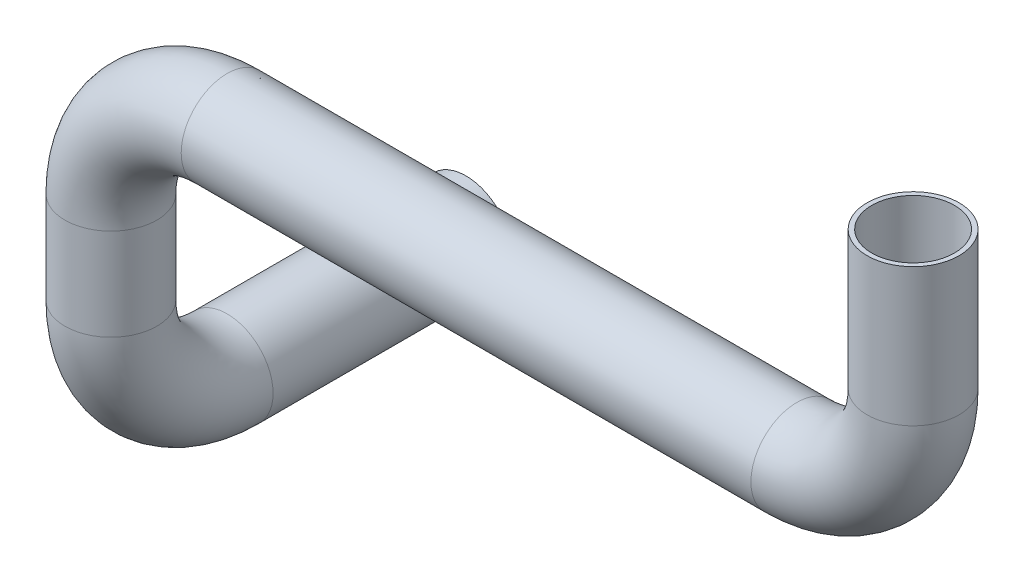
ISO-10303-21;
HEADER;
FILE_DESCRIPTION(('STEP AP214'),'2;1');
FILE_NAME('part.step','',(''),(''),'','','');
FILE_SCHEMA(('AUTOMOTIVE_DESIGN { 1 0 10303 214 1 1 1 1 }'));
ENDSEC;
DATA;
#1=APPLICATION_CONTEXT('core data for automotive mechanical design processes');
#2=APPLICATION_PROTOCOL_DEFINITION('international standard','automotive_design',2000,#1);
#3=PRODUCT_CONTEXT('',#1,'mechanical');
#4=PRODUCT('Part','Part','',(#3));
#5=PRODUCT_RELATED_PRODUCT_CATEGORY('part','',(#4));
#6=PRODUCT_DEFINITION_FORMATION('','',#4);
#7=PRODUCT_DEFINITION_CONTEXT('part definition',#1,'design');
#8=PRODUCT_DEFINITION('design','',#6,#7);
#9=PRODUCT_DEFINITION_SHAPE('','',#8);
#10=(LENGTH_UNIT() NAMED_UNIT(*) SI_UNIT(.MILLI.,.METRE.));
#11=(NAMED_UNIT(*) PLANE_ANGLE_UNIT() SI_UNIT($,.RADIAN.));
#12=(NAMED_UNIT(*) SI_UNIT($,.STERADIAN.) SOLID_ANGLE_UNIT());
#13=UNCERTAINTY_MEASURE_WITH_UNIT(LENGTH_MEASURE(1.E-05),#10,'distance_accuracy_value','');
#14=(GEOMETRIC_REPRESENTATION_CONTEXT(3) GLOBAL_UNCERTAINTY_ASSIGNED_CONTEXT((#13)) GLOBAL_UNIT_ASSIGNED_CONTEXT((#10,
#11,#12)) REPRESENTATION_CONTEXT('',''));
#15=CARTESIAN_POINT('',(0.,0.,0.));
#16=DIRECTION('',(0.,0.,1.));
#17=DIRECTION('',(1.,0.,0.));
#18=AXIS2_PLACEMENT_3D('',#15,#16,#17);
#19=CARTESIAN_POINT('',(0.,0.,0.));
#20=DIRECTION('',(0.,1.,0.));
#21=DIRECTION('',(1.,0.,0.));
#22=AXIS2_PLACEMENT_3D('',#19,#20,#21);
#23=PLANE('',#22);
#24=CARTESIAN_POINT('',(0.,0.,0.));
#25=DIRECTION('',(0.,1.,0.));
#26=DIRECTION('',(0.,0.,1.));
#27=AXIS2_PLACEMENT_3D('',#24,#25,#26);
#28=CIRCLE('',#27,4.5);
#29=CARTESIAN_POINT('',(0.,0.,4.5));
#30=VERTEX_POINT('',#29);
#31=EDGE_CURVE('E93',#30,#30,#28,.T.);
#32=ORIENTED_EDGE('',*,*,#31,.F.);
#33=EDGE_LOOP('',(#32));
#34=FACE_BOUND('',#33,.T.);
#35=CARTESIAN_POINT('',(0.,0.,0.));
#36=DIRECTION('',(0.,1.,0.));
#37=DIRECTION('',(1.,0.,0.));
#38=AXIS2_PLACEMENT_3D('',#35,#36,#37);
#39=CIRCLE('',#38,5.);
#40=CARTESIAN_POINT('',(5.,0.,0.));
#41=VERTEX_POINT('',#40);
#42=EDGE_CURVE('E84',#41,#41,#39,.T.);
#43=ORIENTED_EDGE('',*,*,#42,.T.);
#44=EDGE_LOOP('',(#43));
#45=FACE_BOUND('',#44,.T.);
#46=ADVANCED_FACE('F49',(#34,#45),#23,.T.);
#47=CARTESIAN_POINT('',(-87.3,-62.95,-38.65));
#48=DIRECTION('',(0.,0.,1.));
#49=DIRECTION('',(1.,0.,0.));
#50=AXIS2_PLACEMENT_3D('',#47,#48,#49);
#51=PLANE('',#50);
#52=CARTESIAN_POINT('',(-87.3,-62.95,-38.65));
#53=DIRECTION('',(0.,0.,1.));
#54=DIRECTION('',(1.,0.,0.));
#55=AXIS2_PLACEMENT_3D('',#52,#53,#54);
#56=CIRCLE('',#55,4.5);
#57=CARTESIAN_POINT('',(-82.8,-62.95,-38.65));
#58=VERTEX_POINT('',#57);
#59=EDGE_CURVE('E88',#58,#58,#56,.T.);
#60=ORIENTED_EDGE('',*,*,#59,.T.);
#61=EDGE_LOOP('',(#60));
#62=FACE_BOUND('',#61,.T.);
#63=CARTESIAN_POINT('',(-87.3,-62.95,-38.65));
#64=DIRECTION('',(0.,0.,1.));
#65=DIRECTION('',(1.,0.,0.));
#66=AXIS2_PLACEMENT_3D('',#63,#64,#65);
#67=CIRCLE('',#66,5.);
#68=CARTESIAN_POINT('',(-82.3,-62.95,-38.65));
#69=VERTEX_POINT('',#68);
#70=EDGE_CURVE('E11',#69,#69,#67,.T.);
#71=ORIENTED_EDGE('',*,*,#70,.F.);
#72=EDGE_LOOP('',(#71));
#73=FACE_BOUND('',#72,.T.);
#74=ADVANCED_FACE('F132',(#62,#73),#51,.F.);
#75=CARTESIAN_POINT('',(0.,0.,0.));
#76=DIRECTION('',(0.,-1.,0.));
#77=DIRECTION('',(0.,0.,-1.));
#78=AXIS2_PLACEMENT_3D('',#75,#76,#77);
#79=CYLINDRICAL_SURFACE('',#78,5.);
#80=CARTESIAN_POINT('',(0.,-15.,0.));
#81=DIRECTION('',(0.,1.,0.));
#82=DIRECTION('',(1.,0.,0.));
#83=AXIS2_PLACEMENT_3D('',#80,#81,#82);
#84=CIRCLE('',#83,5.);
#85=CARTESIAN_POINT('',(5.00000000000001,-15.,0.));
#86=VERTEX_POINT('',#85);
#87=EDGE_CURVE('E80',#86,#86,#84,.T.);
#88=ORIENTED_EDGE('',*,*,#87,.T.);
#89=EDGE_LOOP('',(#88));
#90=FACE_BOUND('',#89,.T.);
#91=ORIENTED_EDGE('',*,*,#42,.F.);
#92=EDGE_LOOP('',(#91));
#93=FACE_BOUND('',#92,.T.);
#94=ADVANCED_FACE('F136',(#90,#93),#79,.T.);
#95=CARTESIAN_POINT('',(-12.65,-15.,0.));
#96=DIRECTION('',(0.,0.,-1.));
#97=DIRECTION('',(-1.,0.,0.));
#98=AXIS2_PLACEMENT_3D('',#95,#96,#97);
#99=TOROIDAL_SURFACE('',#98,12.65,5.);
#100=CARTESIAN_POINT('',(-12.65,-27.65,0.));
#101=DIRECTION('',(1.,0.,0.));
#102=DIRECTION('',(0.,-1.,0.));
#103=AXIS2_PLACEMENT_3D('',#100,#101,#102);
#104=CIRCLE('',#103,5.);
#105=CARTESIAN_POINT('',(-12.65,-32.65,0.));
#106=VERTEX_POINT('',#105);
#107=EDGE_CURVE('E76',#106,#106,#104,.T.);
#108=CARTESIAN_POINT('',(-12.65,-15.,0.));
#109=DIRECTION('',(0.,0.,-1.));
#110=DIRECTION('',(-1.,0.,0.));
#111=AXIS2_PLACEMENT_3D('',#108,#109,#110);
#112=CIRCLE('',#111,17.65);
#113=EDGE_CURVE('',#86,#106,#112,.T.);
#114=ORIENTED_EDGE('',*,*,#87,.F.);
#115=ORIENTED_EDGE('',*,*,#107,.T.);
#116=ORIENTED_EDGE('',*,*,#113,.T.);
#117=ORIENTED_EDGE('',*,*,#113,.F.);
#118=EDGE_LOOP('',(#114,#116,#115,#117));
#119=FACE_BOUND('',#118,.T.);
#120=ADVANCED_FACE('F138',(#119),#99,.T.);
#121=CARTESIAN_POINT('',(-12.65,-27.65,0.));
#122=DIRECTION('',(-1.,0.,0.));
#123=DIRECTION('',(0.,-1.,0.));
#124=AXIS2_PLACEMENT_3D('',#121,#122,#123);
#125=CYLINDRICAL_SURFACE('',#124,5.);
#126=CARTESIAN_POINT('',(-74.65,-27.65,0.));
#127=DIRECTION('',(1.,0.,0.));
#128=DIRECTION('',(0.,-1.,0.));
#129=AXIS2_PLACEMENT_3D('',#126,#127,#128);
#130=CIRCLE('',#129,5.);
#131=CARTESIAN_POINT('',(-74.65,-22.65,0.));
#132=VERTEX_POINT('',#131);
#133=EDGE_CURVE('E72',#132,#132,#130,.T.);
#134=ORIENTED_EDGE('',*,*,#133,.T.);
#135=EDGE_LOOP('',(#134));
#136=FACE_BOUND('',#135,.T.);
#137=ORIENTED_EDGE('',*,*,#107,.F.);
#138=EDGE_LOOP('',(#137));
#139=FACE_BOUND('',#138,.T.);
#140=ADVANCED_FACE('F145',(#136,#139),#125,.T.);
#141=CARTESIAN_POINT('',(-74.65,-40.3,0.));
#142=DIRECTION('',(0.,0.,1.));
#143=DIRECTION('',(1.,0.,0.));
#144=AXIS2_PLACEMENT_3D('',#141,#142,#143);
#145=TOROIDAL_SURFACE('',#144,12.65,5.);
#146=CARTESIAN_POINT('',(-87.3,-40.3,0.));
#147=DIRECTION('',(0.,1.,0.));
#148=DIRECTION('',(1.,0.,0.));
#149=AXIS2_PLACEMENT_3D('',#146,#147,#148);
#150=CIRCLE('',#149,5.);
#151=CARTESIAN_POINT('',(-92.3,-40.3,0.));
#152=VERTEX_POINT('',#151);
#153=EDGE_CURVE('E66',#152,#152,#150,.T.);
#154=CARTESIAN_POINT('',(-74.65,-40.3,0.));
#155=DIRECTION('',(0.,0.,1.));
#156=DIRECTION('',(1.,0.,0.));
#157=AXIS2_PLACEMENT_3D('',#154,#155,#156);
#158=CIRCLE('',#157,17.65);
#159=EDGE_CURVE('',#132,#152,#158,.T.);
#160=ORIENTED_EDGE('',*,*,#133,.F.);
#161=ORIENTED_EDGE('',*,*,#153,.T.);
#162=ORIENTED_EDGE('',*,*,#159,.T.);
#163=ORIENTED_EDGE('',*,*,#159,.F.);
#164=EDGE_LOOP('',(#160,#162,#161,#163));
#165=FACE_BOUND('',#164,.T.);
#166=ADVANCED_FACE('F162',(#165),#145,.T.);
#167=CARTESIAN_POINT('',(-87.3,-40.3,0.));
#168=DIRECTION('',(0.,-1.,0.));
#169=DIRECTION('',(0.,0.,-1.));
#170=AXIS2_PLACEMENT_3D('',#167,#168,#169);
#171=CYLINDRICAL_SURFACE('',#170,5.);
#172=CARTESIAN_POINT('',(-87.3,-50.3,0.));
#173=DIRECTION('',(0.,1.,0.));
#174=DIRECTION('',(1.,0.,0.));
#175=AXIS2_PLACEMENT_3D('',#172,#173,#174);
#176=CIRCLE('',#175,5.);
#177=CARTESIAN_POINT('',(-87.3,-50.3,4.99999999999999));
#178=VERTEX_POINT('',#177);
#179=EDGE_CURVE('E61',#178,#178,#176,.T.);
#180=ORIENTED_EDGE('',*,*,#179,.T.);
#181=EDGE_LOOP('',(#180));
#182=FACE_BOUND('',#181,.T.);
#183=ORIENTED_EDGE('',*,*,#153,.F.);
#184=EDGE_LOOP('',(#183));
#185=FACE_BOUND('',#184,.T.);
#186=ADVANCED_FACE('F156',(#182,#185),#171,.T.);
#187=CARTESIAN_POINT('',(-87.3,-50.3,-12.65));
#188=DIRECTION('',(1.,0.,0.));
#189=DIRECTION('',(0.,0.,-1.));
#190=AXIS2_PLACEMENT_3D('',#187,#188,#189);
#191=TOROIDAL_SURFACE('',#190,12.65,5.);
#192=CARTESIAN_POINT('',(-87.3,-62.95,-12.65));
#193=DIRECTION('',(0.,0.,1.));
#194=DIRECTION('',(1.,0.,0.));
#195=AXIS2_PLACEMENT_3D('',#192,#193,#194);
#196=CIRCLE('',#195,5.);
#197=CARTESIAN_POINT('',(-87.3,-67.95,-12.65));
#198=VERTEX_POINT('',#197);
#199=EDGE_CURVE('E56',#198,#198,#196,.T.);
#200=CARTESIAN_POINT('',(-87.3,-50.3,-12.65));
#201=DIRECTION('',(1.,0.,0.));
#202=DIRECTION('',(0.,0.,-1.));
#203=AXIS2_PLACEMENT_3D('',#200,#201,#202);
#204=CIRCLE('',#203,17.65);
#205=EDGE_CURVE('',#178,#198,#204,.T.);
#206=ORIENTED_EDGE('',*,*,#179,.F.);
#207=ORIENTED_EDGE('',*,*,#199,.T.);
#208=ORIENTED_EDGE('',*,*,#205,.T.);
#209=ORIENTED_EDGE('',*,*,#205,.F.);
#210=EDGE_LOOP('',(#206,#208,#207,#209));
#211=FACE_BOUND('',#210,.T.);
#212=ADVANCED_FACE('F151',(#211),#191,.T.);
#213=CARTESIAN_POINT('',(-87.3,-62.95,-12.65));
#214=DIRECTION('',(0.,0.,-1.));
#215=DIRECTION('',(0.,1.,0.));
#216=AXIS2_PLACEMENT_3D('',#213,#214,#215);
#217=CYLINDRICAL_SURFACE('',#216,5.);
#218=ORIENTED_EDGE('',*,*,#70,.T.);
#219=EDGE_LOOP('',(#218));
#220=FACE_BOUND('',#219,.T.);
#221=ORIENTED_EDGE('',*,*,#199,.F.);
#222=EDGE_LOOP('',(#221));
#223=FACE_BOUND('',#222,.T.);
#224=ADVANCED_FACE('F126',(#220,#223),#217,.T.);
#225=CARTESIAN_POINT('',(0.,0.,0.));
#226=DIRECTION('',(0.,-1.,0.));
#227=DIRECTION('',(0.,0.,-1.));
#228=AXIS2_PLACEMENT_3D('',#225,#226,#227);
#229=CYLINDRICAL_SURFACE('',#228,4.5);
#230=CARTESIAN_POINT('',(0.,-15.,0.));
#231=DIRECTION('',(0.,-1.,0.));
#232=DIRECTION('',(0.,0.,-1.));
#233=AXIS2_PLACEMENT_3D('',#230,#231,#232);
#234=CIRCLE('',#233,4.5);
#235=CARTESIAN_POINT('',(4.50000000000001,-15.,0.));
#236=VERTEX_POINT('',#235);
#237=EDGE_CURVE('E97',#236,#236,#234,.F.);
#238=ORIENTED_EDGE('',*,*,#237,.F.);
#239=EDGE_LOOP('',(#238));
#240=FACE_BOUND('',#239,.T.);
#241=ORIENTED_EDGE('',*,*,#31,.T.);
#242=EDGE_LOOP('',(#241));
#243=FACE_BOUND('',#242,.T.);
#244=ADVANCED_FACE('F123',(#240,#243),#229,.F.);
#245=CARTESIAN_POINT('',(-12.65,-15.,0.));
#246=DIRECTION('',(0.,0.,-1.));
#247=DIRECTION('',(-1.,0.,0.));
#248=AXIS2_PLACEMENT_3D('',#245,#246,#247);
#249=TOROIDAL_SURFACE('',#248,12.65,4.5);
#250=CARTESIAN_POINT('',(-12.65,-27.65,0.));
#251=DIRECTION('',(1.,0.,0.));
#252=DIRECTION('',(0.,1.,0.));
#253=AXIS2_PLACEMENT_3D('',#250,#251,#252);
#254=CIRCLE('',#253,4.5);
#255=CARTESIAN_POINT('',(-12.65,-32.15,0.));
#256=VERTEX_POINT('',#255);
#257=EDGE_CURVE('E113',#256,#256,#254,.T.);
#258=CARTESIAN_POINT('',(-12.65,-15.,0.));
#259=DIRECTION('',(0.,0.,-1.));
#260=DIRECTION('',(-1.,0.,0.));
#261=AXIS2_PLACEMENT_3D('',#258,#259,#260);
#262=CIRCLE('',#261,17.15);
#263=EDGE_CURVE('',#236,#256,#262,.T.);
#264=ORIENTED_EDGE('',*,*,#237,.T.);
#265=ORIENTED_EDGE('',*,*,#257,.F.);
#266=ORIENTED_EDGE('',*,*,#263,.T.);
#267=ORIENTED_EDGE('',*,*,#263,.F.);
#268=EDGE_LOOP('',(#264,#266,#265,#267));
#269=FACE_BOUND('',#268,.T.);
#270=ADVANCED_FACE('F121',(#269),#249,.F.);
#271=CARTESIAN_POINT('',(-12.65,-27.65,0.));
#272=DIRECTION('',(-1.,0.,0.));
#273=DIRECTION('',(0.,-1.,0.));
#274=AXIS2_PLACEMENT_3D('',#271,#272,#273);
#275=CYLINDRICAL_SURFACE('',#274,4.5);
#276=CARTESIAN_POINT('',(-74.65,-27.65,0.));
#277=DIRECTION('',(-1.,0.,0.));
#278=DIRECTION('',(0.,-1.,0.));
#279=AXIS2_PLACEMENT_3D('',#276,#277,#278);
#280=CIRCLE('',#279,4.5);
#281=CARTESIAN_POINT('',(-74.65,-23.15,0.));
#282=VERTEX_POINT('',#281);
#283=EDGE_CURVE('E109',#282,#282,#280,.F.);
#284=ORIENTED_EDGE('',*,*,#283,.F.);
#285=EDGE_LOOP('',(#284));
#286=FACE_BOUND('',#285,.T.);
#287=ORIENTED_EDGE('',*,*,#257,.T.);
#288=EDGE_LOOP('',(#287));
#289=FACE_BOUND('',#288,.T.);
#290=ADVANCED_FACE('F210',(#286,#289),#275,.F.);
#291=CARTESIAN_POINT('',(-74.65,-40.3,0.));
#292=DIRECTION('',(0.,0.,1.));
#293=DIRECTION('',(1.,0.,0.));
#294=AXIS2_PLACEMENT_3D('',#291,#292,#293);
#295=TOROIDAL_SURFACE('',#294,12.65,4.5);
#296=CARTESIAN_POINT('',(-87.3,-40.3,0.));
#297=DIRECTION('',(0.,1.,0.));
#298=DIRECTION('',(-1.,0.,0.));
#299=AXIS2_PLACEMENT_3D('',#296,#297,#298);
#300=CIRCLE('',#299,4.5);
#301=CARTESIAN_POINT('',(-91.8,-40.3,0.));
#302=VERTEX_POINT('',#301);
#303=EDGE_CURVE('E105',#302,#302,#300,.T.);
#304=CARTESIAN_POINT('',(-74.65,-40.3,0.));
#305=DIRECTION('',(0.,0.,1.));
#306=DIRECTION('',(1.,0.,0.));
#307=AXIS2_PLACEMENT_3D('',#304,#305,#306);
#308=CIRCLE('',#307,17.15);
#309=EDGE_CURVE('',#282,#302,#308,.T.);
#310=ORIENTED_EDGE('',*,*,#283,.T.);
#311=ORIENTED_EDGE('',*,*,#303,.F.);
#312=ORIENTED_EDGE('',*,*,#309,.T.);
#313=ORIENTED_EDGE('',*,*,#309,.F.);
#314=EDGE_LOOP('',(#310,#312,#311,#313));
#315=FACE_BOUND('',#314,.T.);
#316=ADVANCED_FACE('F220',(#315),#295,.F.);
#317=CARTESIAN_POINT('',(-87.3,-40.3,0.));
#318=DIRECTION('',(0.,-1.,0.));
#319=DIRECTION('',(0.,0.,-1.));
#320=AXIS2_PLACEMENT_3D('',#317,#318,#319);
#321=CYLINDRICAL_SURFACE('',#320,4.5);
#322=CARTESIAN_POINT('',(-87.3,-50.3,0.));
#323=DIRECTION('',(0.,-1.,0.));
#324=DIRECTION('',(0.,0.,-1.));
#325=AXIS2_PLACEMENT_3D('',#322,#323,#324);
#326=CIRCLE('',#325,4.5);
#327=CARTESIAN_POINT('',(-87.3,-50.3,4.49999999999999));
#328=VERTEX_POINT('',#327);
#329=EDGE_CURVE('E101',#328,#328,#326,.F.);
#330=ORIENTED_EDGE('',*,*,#329,.F.);
#331=EDGE_LOOP('',(#330));
#332=FACE_BOUND('',#331,.T.);
#333=ORIENTED_EDGE('',*,*,#303,.T.);
#334=EDGE_LOOP('',(#333));
#335=FACE_BOUND('',#334,.T.);
#336=ADVANCED_FACE('F230',(#332,#335),#321,.F.);
#337=CARTESIAN_POINT('',(-87.3,-50.3,-12.65));
#338=DIRECTION('',(1.,0.,0.));
#339=DIRECTION('',(0.,0.,-1.));
#340=AXIS2_PLACEMENT_3D('',#337,#338,#339);
#341=TOROIDAL_SURFACE('',#340,12.65,4.5);
#342=CARTESIAN_POINT('',(-87.3,-62.95,-12.65));
#343=DIRECTION('',(0.,0.,1.));
#344=DIRECTION('',(0.,-1.,0.));
#345=AXIS2_PLACEMENT_3D('',#342,#343,#344);
#346=CIRCLE('',#345,4.5);
#347=CARTESIAN_POINT('',(-87.3,-67.45,-12.65));
#348=VERTEX_POINT('',#347);
#349=EDGE_CURVE('E92',#348,#348,#346,.T.);
#350=CARTESIAN_POINT('',(-87.3,-50.3,-12.65));
#351=DIRECTION('',(1.,0.,0.));
#352=DIRECTION('',(0.,0.,-1.));
#353=AXIS2_PLACEMENT_3D('',#350,#351,#352);
#354=CIRCLE('',#353,17.15);
#355=EDGE_CURVE('',#328,#348,#354,.T.);
#356=ORIENTED_EDGE('',*,*,#329,.T.);
#357=ORIENTED_EDGE('',*,*,#349,.F.);
#358=ORIENTED_EDGE('',*,*,#355,.T.);
#359=ORIENTED_EDGE('',*,*,#355,.F.);
#360=EDGE_LOOP('',(#356,#358,#357,#359));
#361=FACE_BOUND('',#360,.T.);
#362=ADVANCED_FACE('F240',(#361),#341,.F.);
#363=CARTESIAN_POINT('',(-87.3,-62.95,-12.65));
#364=DIRECTION('',(0.,0.,-1.));
#365=DIRECTION('',(0.,1.,0.));
#366=AXIS2_PLACEMENT_3D('',#363,#364,#365);
#367=CYLINDRICAL_SURFACE('',#366,4.5);
#368=ORIENTED_EDGE('',*,*,#59,.F.);
#369=EDGE_LOOP('',(#368));
#370=FACE_BOUND('',#369,.T.);
#371=ORIENTED_EDGE('',*,*,#349,.T.);
#372=EDGE_LOOP('',(#371));
#373=FACE_BOUND('',#372,.T.);
#374=ADVANCED_FACE('F133',(#370,#373),#367,.F.);
#375=CLOSED_SHELL('',(#46,#74,#94,#120,#140,#166,#186,#212,#224,#244,#270,#290,#316,#336,#362,#374));
#376=MANIFOLD_SOLID_BREP('B2',#375);
#377=ADVANCED_BREP_SHAPE_REPRESENTATION('',(#18,#376),#14);
#378=SHAPE_DEFINITION_REPRESENTATION(#9,#377);
ENDSEC;
END-ISO-10303-21;
